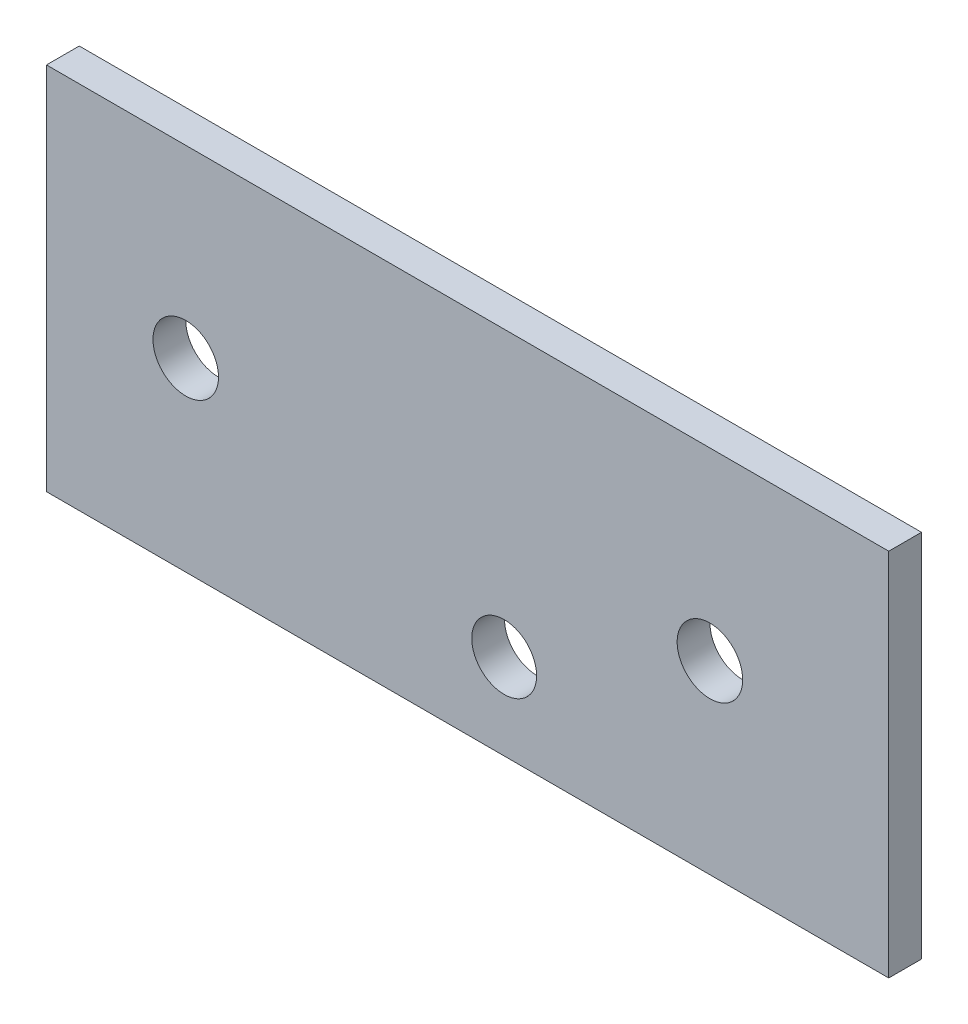
ISO-10303-21;
HEADER;
FILE_DESCRIPTION(('STEP AP214'),'2;1');
FILE_NAME('part.step','',(''),(''),'','','');
FILE_SCHEMA(('AUTOMOTIVE_DESIGN { 1 0 10303 214 1 1 1 1 }'));
ENDSEC;
DATA;
#1=APPLICATION_CONTEXT('core data for automotive mechanical design processes');
#2=APPLICATION_PROTOCOL_DEFINITION('international standard','automotive_design',2000,#1);
#3=PRODUCT_CONTEXT('',#1,'mechanical');
#4=PRODUCT('Part','Part','',(#3));
#5=PRODUCT_RELATED_PRODUCT_CATEGORY('part','',(#4));
#6=PRODUCT_DEFINITION_FORMATION('','',#4);
#7=PRODUCT_DEFINITION_CONTEXT('part definition',#1,'design');
#8=PRODUCT_DEFINITION('design','',#6,#7);
#9=PRODUCT_DEFINITION_SHAPE('','',#8);
#10=(LENGTH_UNIT() NAMED_UNIT(*) SI_UNIT(.MILLI.,.METRE.));
#11=(NAMED_UNIT(*) PLANE_ANGLE_UNIT() SI_UNIT($,.RADIAN.));
#12=(NAMED_UNIT(*) SI_UNIT($,.STERADIAN.) SOLID_ANGLE_UNIT());
#13=UNCERTAINTY_MEASURE_WITH_UNIT(LENGTH_MEASURE(1.E-05),#10,'distance_accuracy_value','');
#14=(GEOMETRIC_REPRESENTATION_CONTEXT(3) GLOBAL_UNCERTAINTY_ASSIGNED_CONTEXT((#13)) GLOBAL_UNIT_ASSIGNED_CONTEXT((#10,
#11,#12)) REPRESENTATION_CONTEXT('',''));
#15=CARTESIAN_POINT('',(0.,0.,0.));
#16=DIRECTION('',(0.,0.,1.));
#17=DIRECTION('',(1.,0.,0.));
#18=AXIS2_PLACEMENT_3D('',#15,#16,#17);
#19=CARTESIAN_POINT('',(0.,0.,3.175));
#20=DIRECTION('',(0.,0.,1.));
#21=DIRECTION('',(1.,0.,0.));
#22=AXIS2_PLACEMENT_3D('',#19,#20,#21);
#23=PLANE('',#22);
#24=CARTESIAN_POINT('',(25.4000000000006,-176.892857142857,3.175));
#25=DIRECTION('',(0.,0.,1.));
#26=DIRECTION('',(1.,0.,0.));
#27=AXIS2_PLACEMENT_3D('',#24,#25,#26);
#28=CIRCLE('',#27,3.17500000000001);
#29=CARTESIAN_POINT('',(28.5750000000006,-176.892857142857,3.175));
#30=VERTEX_POINT('',#29);
#31=EDGE_CURVE('E121',#30,#30,#28,.T.);
#32=ORIENTED_EDGE('',*,*,#31,.F.);
#33=EDGE_LOOP('',(#32));
#34=FACE_BOUND('',#33,.T.);
#35=DIRECTION('',(0.,-1.,0.));
#36=VECTOR('',#35,1.);
#37=CARTESIAN_POINT('',(-38.8941278797457,-159.024028170471,3.175));
#38=LINE('',#37,#36);
#39=CARTESIAN_POINT('',(-38.8941278797457,-159.024028170471,3.175));
#40=VERTEX_POINT('',#39);
#41=CARTESIAN_POINT('',(-38.8941278797457,-194.846228938188,3.175));
#42=VERTEX_POINT('',#41);
#43=EDGE_CURVE('E91',#40,#42,#38,.T.);
#44=ORIENTED_EDGE('',*,*,#43,.T.);
#45=DIRECTION('',(1.,0.,0.));
#46=VECTOR('',#45,1.);
#47=CARTESIAN_POINT('',(-38.8941278797457,-194.846228938188,3.175));
#48=LINE('',#47,#46);
#49=CARTESIAN_POINT('',(42.7305882974382,-194.846228938188,3.175));
#50=VERTEX_POINT('',#49);
#51=EDGE_CURVE('E86',#42,#50,#48,.T.);
#52=ORIENTED_EDGE('',*,*,#51,.T.);
#53=DIRECTION('',(0.,1.,0.));
#54=VECTOR('',#53,1.);
#55=CARTESIAN_POINT('',(42.7305882974382,-159.024028170471,3.175));
#56=LINE('',#55,#54);
#57=CARTESIAN_POINT('',(42.7305882974382,-159.024028170471,3.175));
#58=VERTEX_POINT('',#57);
#59=EDGE_CURVE('E89',#50,#58,#56,.T.);
#60=ORIENTED_EDGE('',*,*,#59,.T.);
#61=DIRECTION('',(-1.,0.,0.));
#62=VECTOR('',#61,1.);
#63=CARTESIAN_POINT('',(-38.8941278797457,-159.024028170471,3.175));
#64=LINE('',#63,#62);
#65=EDGE_CURVE('E56',#58,#40,#64,.T.);
#66=ORIENTED_EDGE('',*,*,#65,.T.);
#67=EDGE_LOOP('',(#44,#52,#60,#66));
#68=FACE_BOUND('',#67,.T.);
#69=CARTESIAN_POINT('',(-25.3999999999994,-176.892857142857,3.175));
#70=DIRECTION('',(0.,0.,1.));
#71=DIRECTION('',(1.,0.,0.));
#72=AXIS2_PLACEMENT_3D('',#69,#70,#71);
#73=CIRCLE('',#72,3.17500000000001);
#74=CARTESIAN_POINT('',(-22.2249999999994,-176.892857142857,3.175));
#75=VERTEX_POINT('',#74);
#76=EDGE_CURVE('E106',#75,#75,#73,.T.);
#77=ORIENTED_EDGE('',*,*,#76,.F.);
#78=EDGE_LOOP('',(#77));
#79=FACE_BOUND('',#78,.T.);
#80=CARTESIAN_POINT('',(5.46100000000046,-186.539687210375,3.175));
#81=DIRECTION('',(0.,0.,1.));
#82=DIRECTION('',(1.,0.,0.));
#83=AXIS2_PLACEMENT_3D('',#80,#81,#82);
#84=CIRCLE('',#83,3.1436177888117);
#85=CARTESIAN_POINT('',(8.60461778881217,-186.539687210375,3.175));
#86=VERTEX_POINT('',#85);
#87=EDGE_CURVE('E127',#86,#86,#84,.T.);
#88=ORIENTED_EDGE('',*,*,#87,.F.);
#89=EDGE_LOOP('',(#88));
#90=FACE_BOUND('',#89,.T.);
#91=ADVANCED_FACE('F39',(#34,#68,#79,#90),#23,.T.);
#92=CARTESIAN_POINT('',(0.,0.,0.));
#93=DIRECTION('',(0.,0.,1.));
#94=DIRECTION('',(1.,0.,0.));
#95=AXIS2_PLACEMENT_3D('',#92,#93,#94);
#96=PLANE('',#95);
#97=DIRECTION('',(0.,-1.,0.));
#98=VECTOR('',#97,1.);
#99=CARTESIAN_POINT('',(-38.8941278797457,-159.024028170471,0.));
#100=LINE('',#99,#98);
#101=CARTESIAN_POINT('',(-38.8941278797457,-159.024028170471,0.));
#102=VERTEX_POINT('',#101);
#103=CARTESIAN_POINT('',(-38.8941278797457,-194.846228938188,0.));
#104=VERTEX_POINT('',#103);
#105=EDGE_CURVE('E103',#102,#104,#100,.T.);
#106=ORIENTED_EDGE('',*,*,#105,.F.);
#107=DIRECTION('',(-1.,0.,0.));
#108=VECTOR('',#107,1.);
#109=CARTESIAN_POINT('',(-38.8941278797457,-159.024028170471,0.));
#110=LINE('',#109,#108);
#111=CARTESIAN_POINT('',(42.7305882974382,-159.024028170471,0.));
#112=VERTEX_POINT('',#111);
#113=EDGE_CURVE('E79',#112,#102,#110,.T.);
#114=ORIENTED_EDGE('',*,*,#113,.F.);
#115=DIRECTION('',(0.,1.,0.));
#116=VECTOR('',#115,1.);
#117=CARTESIAN_POINT('',(42.7305882974382,-159.024028170471,0.));
#118=LINE('',#117,#116);
#119=CARTESIAN_POINT('',(42.7305882974382,-194.846228938188,0.));
#120=VERTEX_POINT('',#119);
#121=EDGE_CURVE('E73',#120,#112,#118,.T.);
#122=ORIENTED_EDGE('',*,*,#121,.F.);
#123=DIRECTION('',(1.,0.,0.));
#124=VECTOR('',#123,1.);
#125=CARTESIAN_POINT('',(-38.8941278797457,-194.846228938188,0.));
#126=LINE('',#125,#124);
#127=EDGE_CURVE('E95',#104,#120,#126,.T.);
#128=ORIENTED_EDGE('',*,*,#127,.F.);
#129=EDGE_LOOP('',(#106,#114,#122,#128));
#130=FACE_BOUND('',#129,.T.);
#131=CARTESIAN_POINT('',(-25.3999999999994,-176.892857142857,0.));
#132=DIRECTION('',(0.,0.,1.));
#133=DIRECTION('',(1.,0.,0.));
#134=AXIS2_PLACEMENT_3D('',#131,#132,#133);
#135=CIRCLE('',#134,3.17500000000001);
#136=CARTESIAN_POINT('',(-22.2249999999994,-176.892857142857,0.));
#137=VERTEX_POINT('',#136);
#138=EDGE_CURVE('E118',#137,#137,#135,.T.);
#139=ORIENTED_EDGE('',*,*,#138,.T.);
#140=EDGE_LOOP('',(#139));
#141=FACE_BOUND('',#140,.T.);
#142=CARTESIAN_POINT('',(25.4000000000006,-176.892857142857,0.));
#143=DIRECTION('',(0.,0.,1.));
#144=DIRECTION('',(1.,0.,0.));
#145=AXIS2_PLACEMENT_3D('',#142,#143,#144);
#146=CIRCLE('',#145,3.17500000000001);
#147=CARTESIAN_POINT('',(28.5750000000006,-176.892857142857,0.));
#148=VERTEX_POINT('',#147);
#149=EDGE_CURVE('E124',#148,#148,#146,.T.);
#150=ORIENTED_EDGE('',*,*,#149,.T.);
#151=EDGE_LOOP('',(#150));
#152=FACE_BOUND('',#151,.T.);
#153=CARTESIAN_POINT('',(5.46100000000046,-186.539687210375,0.));
#154=DIRECTION('',(0.,0.,1.));
#155=DIRECTION('',(1.,0.,0.));
#156=AXIS2_PLACEMENT_3D('',#153,#154,#155);
#157=CIRCLE('',#156,3.1436177888117);
#158=CARTESIAN_POINT('',(8.60461778881217,-186.539687210375,0.));
#159=VERTEX_POINT('',#158);
#160=EDGE_CURVE('E130',#159,#159,#157,.T.);
#161=ORIENTED_EDGE('',*,*,#160,.T.);
#162=EDGE_LOOP('',(#161));
#163=FACE_BOUND('',#162,.T.);
#164=ADVANCED_FACE('F114',(#130,#141,#152,#163),#96,.F.);
#165=CARTESIAN_POINT('',(-38.8941278797457,-159.024028170471,3.175));
#166=DIRECTION('',(1.,0.,0.));
#167=DIRECTION('',(0.,0.,-1.));
#168=AXIS2_PLACEMENT_3D('',#165,#166,#167);
#169=PLANE('',#168);
#170=ORIENTED_EDGE('',*,*,#105,.T.);
#171=DIRECTION('',(0.,0.,-1.));
#172=VECTOR('',#171,1.);
#173=CARTESIAN_POINT('',(-38.8941278797457,-194.846228938188,3.175));
#174=LINE('',#173,#172);
#175=EDGE_CURVE('E11',#42,#104,#174,.T.);
#176=ORIENTED_EDGE('',*,*,#175,.F.);
#177=ORIENTED_EDGE('',*,*,#43,.F.);
#178=DIRECTION('',(0.,0.,-1.));
#179=VECTOR('',#178,1.);
#180=CARTESIAN_POINT('',(-38.8941278797457,-159.024028170471,3.175));
#181=LINE('',#180,#179);
#182=EDGE_CURVE('E99',#40,#102,#181,.T.);
#183=ORIENTED_EDGE('',*,*,#182,.T.);
#184=EDGE_LOOP('',(#170,#176,#177,#183));
#185=FACE_BOUND('',#184,.T.);
#186=ADVANCED_FACE('F41',(#185),#169,.F.);
#187=CARTESIAN_POINT('',(-38.8941278797457,-194.846228938188,3.175));
#188=DIRECTION('',(0.,1.,0.));
#189=DIRECTION('',(0.,0.,1.));
#190=AXIS2_PLACEMENT_3D('',#187,#188,#189);
#191=PLANE('',#190);
#192=ORIENTED_EDGE('',*,*,#127,.T.);
#193=DIRECTION('',(0.,0.,-1.));
#194=VECTOR('',#193,1.);
#195=CARTESIAN_POINT('',(42.7305882974382,-194.846228938188,3.175));
#196=LINE('',#195,#194);
#197=EDGE_CURVE('E48',#50,#120,#196,.T.);
#198=ORIENTED_EDGE('',*,*,#197,.F.);
#199=ORIENTED_EDGE('',*,*,#51,.F.);
#200=ORIENTED_EDGE('',*,*,#175,.T.);
#201=EDGE_LOOP('',(#192,#198,#199,#200));
#202=FACE_BOUND('',#201,.T.);
#203=ADVANCED_FACE('F94',(#202),#191,.F.);
#204=CARTESIAN_POINT('',(42.7305882974382,-159.024028170471,3.175));
#205=DIRECTION('',(-1.,0.,0.));
#206=DIRECTION('',(0.,0.,1.));
#207=AXIS2_PLACEMENT_3D('',#204,#205,#206);
#208=PLANE('',#207);
#209=ORIENTED_EDGE('',*,*,#121,.T.);
#210=DIRECTION('',(0.,0.,-1.));
#211=VECTOR('',#210,1.);
#212=CARTESIAN_POINT('',(42.7305882974382,-159.024028170471,3.175));
#213=LINE('',#212,#211);
#214=EDGE_CURVE('E96',#58,#112,#213,.T.);
#215=ORIENTED_EDGE('',*,*,#214,.F.);
#216=ORIENTED_EDGE('',*,*,#59,.F.);
#217=ORIENTED_EDGE('',*,*,#197,.T.);
#218=EDGE_LOOP('',(#209,#215,#216,#217));
#219=FACE_BOUND('',#218,.T.);
#220=ADVANCED_FACE('F97',(#219),#208,.F.);
#221=CARTESIAN_POINT('',(-38.8941278797457,-159.024028170471,3.175));
#222=DIRECTION('',(0.,-1.,0.));
#223=DIRECTION('',(0.,0.,-1.));
#224=AXIS2_PLACEMENT_3D('',#221,#222,#223);
#225=PLANE('',#224);
#226=ORIENTED_EDGE('',*,*,#113,.T.);
#227=ORIENTED_EDGE('',*,*,#182,.F.);
#228=ORIENTED_EDGE('',*,*,#65,.F.);
#229=ORIENTED_EDGE('',*,*,#214,.T.);
#230=EDGE_LOOP('',(#226,#227,#228,#229));
#231=FACE_BOUND('',#230,.T.);
#232=ADVANCED_FACE('F111',(#231),#225,.F.);
#233=CARTESIAN_POINT('',(-25.3999999999994,-176.892857142857,3.175));
#234=DIRECTION('',(0.,0.,-1.));
#235=DIRECTION('',(-1.,0.,0.));
#236=AXIS2_PLACEMENT_3D('',#233,#234,#235);
#237=CYLINDRICAL_SURFACE('',#236,3.17500000000001);
#238=ORIENTED_EDGE('',*,*,#76,.T.);
#239=EDGE_LOOP('',(#238));
#240=FACE_BOUND('',#239,.T.);
#241=ORIENTED_EDGE('',*,*,#138,.F.);
#242=EDGE_LOOP('',(#241));
#243=FACE_BOUND('',#242,.T.);
#244=ADVANCED_FACE('F148',(#240,#243),#237,.F.);
#245=CARTESIAN_POINT('',(25.4000000000006,-176.892857142857,3.175));
#246=DIRECTION('',(0.,0.,-1.));
#247=DIRECTION('',(-1.,0.,0.));
#248=AXIS2_PLACEMENT_3D('',#245,#246,#247);
#249=CYLINDRICAL_SURFACE('',#248,3.17500000000001);
#250=ORIENTED_EDGE('',*,*,#31,.T.);
#251=EDGE_LOOP('',(#250));
#252=FACE_BOUND('',#251,.T.);
#253=ORIENTED_EDGE('',*,*,#149,.F.);
#254=EDGE_LOOP('',(#253));
#255=FACE_BOUND('',#254,.T.);
#256=ADVANCED_FACE('F193',(#252,#255),#249,.F.);
#257=CARTESIAN_POINT('',(5.46100000000046,-186.539687210375,3.175));
#258=DIRECTION('',(0.,0.,-1.));
#259=DIRECTION('',(-1.,0.,0.));
#260=AXIS2_PLACEMENT_3D('',#257,#258,#259);
#261=CYLINDRICAL_SURFACE('',#260,3.1436177888117);
#262=ORIENTED_EDGE('',*,*,#87,.T.);
#263=EDGE_LOOP('',(#262));
#264=FACE_BOUND('',#263,.T.);
#265=ORIENTED_EDGE('',*,*,#160,.F.);
#266=EDGE_LOOP('',(#265));
#267=FACE_BOUND('',#266,.T.);
#268=ADVANCED_FACE('F136',(#264,#267),#261,.F.);
#269=CLOSED_SHELL('',(#91,#164,#186,#203,#220,#232,#244,#256,#268));
#270=MANIFOLD_SOLID_BREP('B2',#269);
#271=ADVANCED_BREP_SHAPE_REPRESENTATION('',(#18,#270),#14);
#272=SHAPE_DEFINITION_REPRESENTATION(#9,#271);
ENDSEC;
END-ISO-10303-21;
